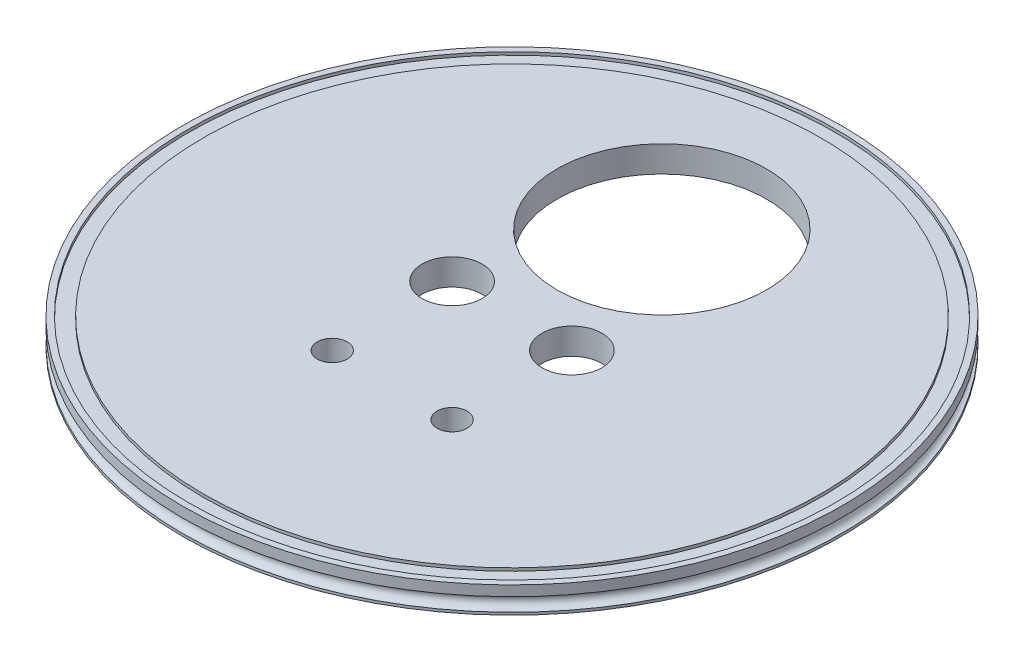
ISO-10303-21;
HEADER;
FILE_DESCRIPTION(('STEP AP214'),'2;1');
FILE_NAME('part.step','',(''),(''),'','','');
FILE_SCHEMA(('AUTOMOTIVE_DESIGN { 1 0 10303 214 1 1 1 1 }'));
ENDSEC;
DATA;
#1=APPLICATION_CONTEXT('core data for automotive mechanical design processes');
#2=APPLICATION_PROTOCOL_DEFINITION('international standard','automotive_design',2000,#1);
#3=PRODUCT_CONTEXT('',#1,'mechanical');
#4=PRODUCT('Part','Part','',(#3));
#5=PRODUCT_RELATED_PRODUCT_CATEGORY('part','',(#4));
#6=PRODUCT_DEFINITION_FORMATION('','',#4);
#7=PRODUCT_DEFINITION_CONTEXT('part definition',#1,'design');
#8=PRODUCT_DEFINITION('design','',#6,#7);
#9=PRODUCT_DEFINITION_SHAPE('','',#8);
#10=(LENGTH_UNIT() NAMED_UNIT(*) SI_UNIT(.MILLI.,.METRE.));
#11=(NAMED_UNIT(*) PLANE_ANGLE_UNIT() SI_UNIT($,.RADIAN.));
#12=(NAMED_UNIT(*) SI_UNIT($,.STERADIAN.) SOLID_ANGLE_UNIT());
#13=UNCERTAINTY_MEASURE_WITH_UNIT(LENGTH_MEASURE(1.E-05),#10,'distance_accuracy_value','');
#14=(GEOMETRIC_REPRESENTATION_CONTEXT(3) GLOBAL_UNCERTAINTY_ASSIGNED_CONTEXT((#13)) GLOBAL_UNIT_ASSIGNED_CONTEXT((#10,
#11,#12)) REPRESENTATION_CONTEXT('',''));
#15=CARTESIAN_POINT('',(0.,0.,0.));
#16=DIRECTION('',(0.,0.,1.));
#17=DIRECTION('',(1.,0.,0.));
#18=AXIS2_PLACEMENT_3D('',#15,#16,#17);
#19=CARTESIAN_POINT('',(130.81,1.36495717747621,0.));
#20=DIRECTION('',(0.,-1.,0.));
#21=DIRECTION('',(0.,0.,-1.));
#22=AXIS2_PLACEMENT_3D('',#19,#20,#21);
#23=PLANE('',#22);
#24=CARTESIAN_POINT('',(0.,1.36495717747621,-63.5));
#25=DIRECTION('',(0.,1.,0.));
#26=DIRECTION('',(0.,0.,1.));
#27=AXIS2_PLACEMENT_3D('',#24,#25,#26);
#28=CIRCLE('',#27,44.45);
#29=CARTESIAN_POINT('',(0.,1.36495717747621,-19.05));
#30=VERTEX_POINT('',#29);
#31=EDGE_CURVE('E101',#30,#30,#28,.T.);
#32=ORIENTED_EDGE('',*,*,#31,.F.);
#33=EDGE_LOOP('',(#32));
#34=FACE_BOUND('',#33,.T.);
#35=CARTESIAN_POINT('',(-25.4,1.36495717747621,0.));
#36=DIRECTION('',(0.,-1.,0.));
#37=DIRECTION('',(0.,0.,-1.));
#38=AXIS2_PLACEMENT_3D('',#35,#36,#37);
#39=CIRCLE('',#38,12.7);
#40=CARTESIAN_POINT('',(-25.4,1.36495717747621,-12.7));
#41=VERTEX_POINT('',#40);
#42=EDGE_CURVE('E92',#41,#41,#39,.T.);
#43=ORIENTED_EDGE('',*,*,#42,.T.);
#44=EDGE_LOOP('',(#43));
#45=FACE_BOUND('',#44,.T.);
#46=CARTESIAN_POINT('',(25.4,1.36495717747621,0.));
#47=DIRECTION('',(0.,-1.,0.));
#48=DIRECTION('',(0.,0.,-1.));
#49=AXIS2_PLACEMENT_3D('',#46,#47,#48);
#50=CIRCLE('',#49,12.7);
#51=CARTESIAN_POINT('',(25.4,1.36495717747621,-12.7));
#52=VERTEX_POINT('',#51);
#53=EDGE_CURVE('E86',#52,#52,#50,.T.);
#54=ORIENTED_EDGE('',*,*,#53,.T.);
#55=EDGE_LOOP('',(#54));
#56=FACE_BOUND('',#55,.T.);
#57=CARTESIAN_POINT('',(-25.4,1.36495717747621,50.8));
#58=DIRECTION('',(0.,1.,0.));
#59=DIRECTION('',(0.,0.,1.));
#60=AXIS2_PLACEMENT_3D('',#57,#58,#59);
#61=CIRCLE('',#60,6.35);
#62=CARTESIAN_POINT('',(-25.4,1.36495717747621,57.15));
#63=VERTEX_POINT('',#62);
#64=EDGE_CURVE('E83',#63,#63,#61,.T.);
#65=ORIENTED_EDGE('',*,*,#64,.F.);
#66=EDGE_LOOP('',(#65));
#67=FACE_BOUND('',#66,.T.);
#68=CARTESIAN_POINT('',(25.4,1.36495717747621,50.8));
#69=DIRECTION('',(0.,1.,0.));
#70=DIRECTION('',(0.,0.,1.));
#71=AXIS2_PLACEMENT_3D('',#68,#69,#70);
#72=CIRCLE('',#71,6.35);
#73=CARTESIAN_POINT('',(25.4,1.36495717747621,57.15));
#74=VERTEX_POINT('',#73);
#75=EDGE_CURVE('E77',#74,#74,#72,.T.);
#76=ORIENTED_EDGE('',*,*,#75,.F.);
#77=EDGE_LOOP('',(#76));
#78=FACE_BOUND('',#77,.T.);
#79=CARTESIAN_POINT('',(0.,1.3649571774762,0.));
#80=DIRECTION('',(0.,1.,0.));
#81=DIRECTION('',(0.,0.,1.));
#82=AXIS2_PLACEMENT_3D('',#79,#80,#81);
#83=CIRCLE('',#82,130.81);
#84=CARTESIAN_POINT('',(0.,1.3649571774762,130.81));
#85=VERTEX_POINT('',#84);
#86=EDGE_CURVE('E73',#85,#85,#83,.T.);
#87=ORIENTED_EDGE('',*,*,#86,.T.);
#88=EDGE_LOOP('',(#87));
#89=FACE_BOUND('',#88,.T.);
#90=ADVANCED_FACE('F33',(#34,#45,#56,#67,#78,#89),#23,.F.);
#91=CARTESIAN_POINT('',(0.,-9.74754282252377,0.));
#92=DIRECTION('',(0.,1.,0.));
#93=DIRECTION('',(0.,0.,1.));
#94=AXIS2_PLACEMENT_3D('',#91,#92,#93);
#95=PLANE('',#94);
#96=CARTESIAN_POINT('',(0.,-9.74754282252377,-63.5));
#97=DIRECTION('',(0.,1.,0.));
#98=DIRECTION('',(0.,0.,1.));
#99=AXIS2_PLACEMENT_3D('',#96,#97,#98);
#100=CIRCLE('',#99,44.45);
#101=CARTESIAN_POINT('',(0.,-9.74754282252377,-19.05));
#102=VERTEX_POINT('',#101);
#103=EDGE_CURVE('E98',#102,#102,#100,.T.);
#104=ORIENTED_EDGE('',*,*,#103,.T.);
#105=EDGE_LOOP('',(#104));
#106=FACE_BOUND('',#105,.T.);
#107=CARTESIAN_POINT('',(-25.4,-9.74754282252377,0.));
#108=DIRECTION('',(0.,-1.,0.));
#109=DIRECTION('',(0.,0.,-1.));
#110=AXIS2_PLACEMENT_3D('',#107,#108,#109);
#111=CIRCLE('',#110,12.7);
#112=CARTESIAN_POINT('',(-25.4,-9.74754282252377,-12.7));
#113=VERTEX_POINT('',#112);
#114=EDGE_CURVE('E95',#113,#113,#111,.T.);
#115=ORIENTED_EDGE('',*,*,#114,.F.);
#116=EDGE_LOOP('',(#115));
#117=FACE_BOUND('',#116,.T.);
#118=CARTESIAN_POINT('',(25.4,-9.74754282252377,0.));
#119=DIRECTION('',(0.,-1.,0.));
#120=DIRECTION('',(0.,0.,-1.));
#121=AXIS2_PLACEMENT_3D('',#118,#119,#120);
#122=CIRCLE('',#121,12.7);
#123=CARTESIAN_POINT('',(25.4,-9.74754282252377,-12.7));
#124=VERTEX_POINT('',#123);
#125=EDGE_CURVE('E89',#124,#124,#122,.T.);
#126=ORIENTED_EDGE('',*,*,#125,.F.);
#127=EDGE_LOOP('',(#126));
#128=FACE_BOUND('',#127,.T.);
#129=CARTESIAN_POINT('',(-25.4,-9.74754282252377,50.8));
#130=DIRECTION('',(0.,1.,0.));
#131=DIRECTION('',(0.,0.,1.));
#132=AXIS2_PLACEMENT_3D('',#129,#130,#131);
#133=CIRCLE('',#132,6.35);
#134=CARTESIAN_POINT('',(-25.4,-9.74754282252377,57.15));
#135=VERTEX_POINT('',#134);
#136=EDGE_CURVE('E80',#135,#135,#133,.T.);
#137=ORIENTED_EDGE('',*,*,#136,.T.);
#138=EDGE_LOOP('',(#137));
#139=FACE_BOUND('',#138,.T.);
#140=CARTESIAN_POINT('',(25.4,-9.74754282252377,50.8));
#141=DIRECTION('',(0.,1.,0.));
#142=DIRECTION('',(0.,0.,1.));
#143=AXIS2_PLACEMENT_3D('',#140,#141,#142);
#144=CIRCLE('',#143,6.35);
#145=CARTESIAN_POINT('',(25.4,-9.74754282252377,57.15));
#146=VERTEX_POINT('',#145);
#147=EDGE_CURVE('E76',#146,#146,#144,.T.);
#148=ORIENTED_EDGE('',*,*,#147,.T.);
#149=EDGE_LOOP('',(#148));
#150=FACE_BOUND('',#149,.T.);
#151=CARTESIAN_POINT('',(0.,-9.74754282252377,0.));
#152=DIRECTION('',(0.,1.,0.));
#153=DIRECTION('',(0.,0.,1.));
#154=AXIS2_PLACEMENT_3D('',#151,#152,#153);
#155=CIRCLE('',#154,120.65);
#156=CARTESIAN_POINT('',(0.,-9.74754282252377,120.65));
#157=VERTEX_POINT('',#156);
#158=EDGE_CURVE('E10',#157,#157,#155,.T.);
#159=ORIENTED_EDGE('',*,*,#158,.F.);
#160=EDGE_LOOP('',(#159));
#161=FACE_BOUND('',#160,.T.);
#162=ADVANCED_FACE('F107',(#106,#117,#128,#139,#150,#161),#95,.F.);
#163=CARTESIAN_POINT('',(0.,12.263795045045,0.));
#164=DIRECTION('',(0.,1.,0.));
#165=DIRECTION('',(0.,0.,1.));
#166=AXIS2_PLACEMENT_3D('',#163,#164,#165);
#167=CYLINDRICAL_SURFACE('',#166,120.65);
#168=CARTESIAN_POINT('',(0.,-7.20754282252377,0.));
#169=DIRECTION('',(0.,1.,0.));
#170=DIRECTION('',(0.,0.,1.));
#171=AXIS2_PLACEMENT_3D('',#168,#169,#170);
#172=CIRCLE('',#171,120.65);
#173=CARTESIAN_POINT('',(0.,-7.20754282252377,120.65));
#174=VERTEX_POINT('',#173);
#175=EDGE_CURVE('E39',#174,#174,#172,.T.);
#176=ORIENTED_EDGE('',*,*,#175,.F.);
#177=EDGE_LOOP('',(#176));
#178=FACE_BOUND('',#177,.T.);
#179=ORIENTED_EDGE('',*,*,#158,.T.);
#180=EDGE_LOOP('',(#179));
#181=FACE_BOUND('',#180,.T.);
#182=ADVANCED_FACE('F186',(#178,#181),#167,.T.);
#183=CARTESIAN_POINT('',(120.65,-7.20754282252377,0.));
#184=DIRECTION('',(0.,1.,0.));
#185=DIRECTION('',(0.,0.,1.));
#186=AXIS2_PLACEMENT_3D('',#183,#184,#185);
#187=PLANE('',#186);
#188=CARTESIAN_POINT('',(0.,-7.20754282252377,0.));
#189=DIRECTION('',(0.,1.,0.));
#190=DIRECTION('',(0.,0.,1.));
#191=AXIS2_PLACEMENT_3D('',#188,#189,#190);
#192=CIRCLE('',#191,127.);
#193=CARTESIAN_POINT('',(0.,-7.20754282252377,127.));
#194=VERTEX_POINT('',#193);
#195=EDGE_CURVE('E43',#194,#194,#192,.T.);
#196=ORIENTED_EDGE('',*,*,#195,.F.);
#197=EDGE_LOOP('',(#196));
#198=FACE_BOUND('',#197,.T.);
#199=ORIENTED_EDGE('',*,*,#175,.T.);
#200=EDGE_LOOP('',(#199));
#201=FACE_BOUND('',#200,.T.);
#202=ADVANCED_FACE('F181',(#198,#201),#187,.F.);
#203=CARTESIAN_POINT('',(0.,12.263795045045,0.));
#204=DIRECTION('',(0.,1.,0.));
#205=DIRECTION('',(0.,0.,1.));
#206=AXIS2_PLACEMENT_3D('',#203,#204,#205);
#207=CYLINDRICAL_SURFACE('',#206,127.);
#208=CARTESIAN_POINT('',(0.,-9.74754282252377,0.));
#209=DIRECTION('',(0.,1.,0.));
#210=DIRECTION('',(0.,0.,1.));
#211=AXIS2_PLACEMENT_3D('',#208,#209,#210);
#212=CIRCLE('',#211,127.);
#213=CARTESIAN_POINT('',(0.,-9.74754282252377,127.));
#214=VERTEX_POINT('',#213);
#215=EDGE_CURVE('E47',#214,#214,#212,.T.);
#216=ORIENTED_EDGE('',*,*,#215,.F.);
#217=EDGE_LOOP('',(#216));
#218=FACE_BOUND('',#217,.T.);
#219=ORIENTED_EDGE('',*,*,#195,.T.);
#220=EDGE_LOOP('',(#219));
#221=FACE_BOUND('',#220,.T.);
#222=ADVANCED_FACE('F175',(#218,#221),#207,.F.);
#223=CARTESIAN_POINT('',(127.,-9.74754282252377,0.));
#224=DIRECTION('',(0.,1.,0.));
#225=DIRECTION('',(0.,0.,1.));
#226=AXIS2_PLACEMENT_3D('',#223,#224,#225);
#227=PLANE('',#226);
#228=CARTESIAN_POINT('',(0.,-9.74754282252377,0.));
#229=DIRECTION('',(0.,1.,0.));
#230=DIRECTION('',(0.,0.,1.));
#231=AXIS2_PLACEMENT_3D('',#228,#229,#230);
#232=CIRCLE('',#231,139.7);
#233=CARTESIAN_POINT('',(0.,-9.74754282252377,139.7));
#234=VERTEX_POINT('',#233);
#235=EDGE_CURVE('E52',#234,#234,#232,.T.);
#236=ORIENTED_EDGE('',*,*,#235,.F.);
#237=EDGE_LOOP('',(#236));
#238=FACE_BOUND('',#237,.T.);
#239=ORIENTED_EDGE('',*,*,#215,.T.);
#240=EDGE_LOOP('',(#239));
#241=FACE_BOUND('',#240,.T.);
#242=ADVANCED_FACE('F169',(#238,#241),#227,.F.);
#243=CARTESIAN_POINT('',(0.,12.263795045045,0.));
#244=DIRECTION('',(0.,1.,0.));
#245=DIRECTION('',(0.,0.,1.));
#246=AXIS2_PLACEMENT_3D('',#243,#244,#245);
#247=CYLINDRICAL_SURFACE('',#246,139.7);
#248=CARTESIAN_POINT('',(0.,-8.66804282252376,0.));
#249=DIRECTION('',(0.,1.,0.));
#250=DIRECTION('',(0.,0.,1.));
#251=AXIS2_PLACEMENT_3D('',#248,#249,#250);
#252=CIRCLE('',#251,139.7);
#253=CARTESIAN_POINT('',(0.,-8.66804282252376,139.7));
#254=VERTEX_POINT('',#253);
#255=EDGE_CURVE('E55',#254,#254,#252,.T.);
#256=ORIENTED_EDGE('',*,*,#255,.F.);
#257=EDGE_LOOP('',(#256));
#258=FACE_BOUND('',#257,.T.);
#259=ORIENTED_EDGE('',*,*,#235,.T.);
#260=EDGE_LOOP('',(#259));
#261=FACE_BOUND('',#260,.T.);
#262=ADVANCED_FACE('F163',(#258,#261),#247,.T.);
#263=CARTESIAN_POINT('',(0.,-5.81054282252378,0.));
#264=DIRECTION('',(0.,1.,0.));
#265=DIRECTION('',(0.,0.,1.));
#266=AXIS2_PLACEMENT_3D('',#263,#264,#265);
#267=TOROIDAL_SURFACE('',#266,139.7,2.85749999999998);
#268=CARTESIAN_POINT('',(0.,-2.9530428225238,0.));
#269=DIRECTION('',(0.,1.,0.));
#270=DIRECTION('',(0.,0.,1.));
#271=AXIS2_PLACEMENT_3D('',#268,#269,#270);
#272=CIRCLE('',#271,139.7);
#273=CARTESIAN_POINT('',(0.,-2.9530428225238,139.7));
#274=VERTEX_POINT('',#273);
#275=EDGE_CURVE('E58',#274,#274,#272,.T.);
#276=ORIENTED_EDGE('',*,*,#275,.F.);
#277=EDGE_LOOP('',(#276));
#278=FACE_BOUND('',#277,.T.);
#279=ORIENTED_EDGE('',*,*,#255,.T.);
#280=EDGE_LOOP('',(#279));
#281=FACE_BOUND('',#280,.T.);
#282=ADVANCED_FACE('F157',(#278,#281),#267,.F.);
#283=CARTESIAN_POINT('',(0.,12.263795045045,0.));
#284=DIRECTION('',(0.,1.,0.));
#285=DIRECTION('',(0.,0.,1.));
#286=AXIS2_PLACEMENT_3D('',#283,#284,#285);
#287=CYLINDRICAL_SURFACE('',#286,139.7);
#288=CARTESIAN_POINT('',(0.,1.3649571774762,0.));
#289=DIRECTION('',(0.,1.,0.));
#290=DIRECTION('',(0.,0.,1.));
#291=AXIS2_PLACEMENT_3D('',#288,#289,#290);
#292=CIRCLE('',#291,139.7);
#293=CARTESIAN_POINT('',(0.,1.3649571774762,139.7));
#294=VERTEX_POINT('',#293);
#295=EDGE_CURVE('E61',#294,#294,#292,.T.);
#296=ORIENTED_EDGE('',*,*,#295,.F.);
#297=EDGE_LOOP('',(#296));
#298=FACE_BOUND('',#297,.T.);
#299=ORIENTED_EDGE('',*,*,#275,.T.);
#300=EDGE_LOOP('',(#299));
#301=FACE_BOUND('',#300,.T.);
#302=ADVANCED_FACE('F151',(#298,#301),#287,.T.);
#303=CARTESIAN_POINT('',(139.7,1.3649571774762,0.));
#304=DIRECTION('',(0.,-1.,0.));
#305=DIRECTION('',(0.,0.,-1.));
#306=AXIS2_PLACEMENT_3D('',#303,#304,#305);
#307=PLANE('',#306);
#308=CARTESIAN_POINT('',(0.,1.3649571774762,0.));
#309=DIRECTION('',(0.,1.,0.));
#310=DIRECTION('',(0.,0.,1.));
#311=AXIS2_PLACEMENT_3D('',#308,#309,#310);
#312=CIRCLE('',#311,137.16);
#313=CARTESIAN_POINT('',(0.,1.3649571774762,137.16));
#314=VERTEX_POINT('',#313);
#315=EDGE_CURVE('E64',#314,#314,#312,.T.);
#316=ORIENTED_EDGE('',*,*,#315,.F.);
#317=EDGE_LOOP('',(#316));
#318=FACE_BOUND('',#317,.T.);
#319=ORIENTED_EDGE('',*,*,#295,.T.);
#320=EDGE_LOOP('',(#319));
#321=FACE_BOUND('',#320,.T.);
#322=ADVANCED_FACE('F145',(#318,#321),#307,.F.);
#323=CARTESIAN_POINT('',(0.,12.263795045045,0.));
#324=DIRECTION('',(0.,1.,0.));
#325=DIRECTION('',(0.,0.,1.));
#326=AXIS2_PLACEMENT_3D('',#323,#324,#325);
#327=CYLINDRICAL_SURFACE('',#326,137.16);
#328=CARTESIAN_POINT('',(0.,0.094957177476233,0.));
#329=DIRECTION('',(0.,1.,0.));
#330=DIRECTION('',(0.,0.,1.));
#331=AXIS2_PLACEMENT_3D('',#328,#329,#330);
#332=CIRCLE('',#331,137.16);
#333=CARTESIAN_POINT('',(0.,0.094957177476233,137.16));
#334=VERTEX_POINT('',#333);
#335=EDGE_CURVE('E67',#334,#334,#332,.T.);
#336=ORIENTED_EDGE('',*,*,#335,.F.);
#337=EDGE_LOOP('',(#336));
#338=FACE_BOUND('',#337,.T.);
#339=ORIENTED_EDGE('',*,*,#315,.T.);
#340=EDGE_LOOP('',(#339));
#341=FACE_BOUND('',#340,.T.);
#342=ADVANCED_FACE('F139',(#338,#341),#327,.F.);
#343=CARTESIAN_POINT('',(130.81,0.0949571774762326,0.));
#344=DIRECTION('',(0.,-1.,0.));
#345=DIRECTION('',(0.,0.,-1.));
#346=AXIS2_PLACEMENT_3D('',#343,#344,#345);
#347=PLANE('',#346);
#348=CARTESIAN_POINT('',(0.,0.094957177476233,0.));
#349=DIRECTION('',(0.,1.,0.));
#350=DIRECTION('',(0.,0.,1.));
#351=AXIS2_PLACEMENT_3D('',#348,#349,#350);
#352=CIRCLE('',#351,130.81);
#353=CARTESIAN_POINT('',(0.,0.094957177476233,130.81));
#354=VERTEX_POINT('',#353);
#355=EDGE_CURVE('E70',#354,#354,#352,.T.);
#356=ORIENTED_EDGE('',*,*,#355,.F.);
#357=EDGE_LOOP('',(#356));
#358=FACE_BOUND('',#357,.T.);
#359=ORIENTED_EDGE('',*,*,#335,.T.);
#360=EDGE_LOOP('',(#359));
#361=FACE_BOUND('',#360,.T.);
#362=ADVANCED_FACE('F133',(#358,#361),#347,.F.);
#363=CARTESIAN_POINT('',(0.,12.263795045045,0.));
#364=DIRECTION('',(0.,1.,0.));
#365=DIRECTION('',(0.,0.,1.));
#366=AXIS2_PLACEMENT_3D('',#363,#364,#365);
#367=CYLINDRICAL_SURFACE('',#366,130.81);
#368=ORIENTED_EDGE('',*,*,#86,.F.);
#369=EDGE_LOOP('',(#368));
#370=FACE_BOUND('',#369,.T.);
#371=ORIENTED_EDGE('',*,*,#355,.T.);
#372=EDGE_LOOP('',(#371));
#373=FACE_BOUND('',#372,.T.);
#374=ADVANCED_FACE('F129',(#370,#373),#367,.T.);
#375=CARTESIAN_POINT('',(25.4,-9.74754282252377,50.8));
#376=DIRECTION('',(0.,1.,0.));
#377=DIRECTION('',(0.,0.,1.));
#378=AXIS2_PLACEMENT_3D('',#375,#376,#377);
#379=CYLINDRICAL_SURFACE('',#378,6.35);
#380=ORIENTED_EDGE('',*,*,#147,.F.);
#381=EDGE_LOOP('',(#380));
#382=FACE_BOUND('',#381,.T.);
#383=ORIENTED_EDGE('',*,*,#75,.T.);
#384=EDGE_LOOP('',(#383));
#385=FACE_BOUND('',#384,.T.);
#386=ADVANCED_FACE('F132',(#382,#385),#379,.F.);
#387=CARTESIAN_POINT('',(-25.4,-9.74754282252377,50.8));
#388=DIRECTION('',(0.,1.,0.));
#389=DIRECTION('',(0.,0.,1.));
#390=AXIS2_PLACEMENT_3D('',#387,#388,#389);
#391=CYLINDRICAL_SURFACE('',#390,6.35);
#392=ORIENTED_EDGE('',*,*,#136,.F.);
#393=EDGE_LOOP('',(#392));
#394=FACE_BOUND('',#393,.T.);
#395=ORIENTED_EDGE('',*,*,#64,.T.);
#396=EDGE_LOOP('',(#395));
#397=FACE_BOUND('',#396,.T.);
#398=ADVANCED_FACE('F270',(#394,#397),#391,.F.);
#399=CARTESIAN_POINT('',(25.4,1.36495717747621,0.));
#400=DIRECTION('',(0.,-1.,0.));
#401=DIRECTION('',(0.,0.,-1.));
#402=AXIS2_PLACEMENT_3D('',#399,#400,#401);
#403=CYLINDRICAL_SURFACE('',#402,12.7);
#404=ORIENTED_EDGE('',*,*,#53,.F.);
#405=EDGE_LOOP('',(#404));
#406=FACE_BOUND('',#405,.T.);
#407=ORIENTED_EDGE('',*,*,#125,.T.);
#408=EDGE_LOOP('',(#407));
#409=FACE_BOUND('',#408,.T.);
#410=ADVANCED_FACE('F280',(#406,#409),#403,.F.);
#411=CARTESIAN_POINT('',(-25.4,1.36495717747621,0.));
#412=DIRECTION('',(0.,-1.,0.));
#413=DIRECTION('',(0.,0.,-1.));
#414=AXIS2_PLACEMENT_3D('',#411,#412,#413);
#415=CYLINDRICAL_SURFACE('',#414,12.7);
#416=ORIENTED_EDGE('',*,*,#42,.F.);
#417=EDGE_LOOP('',(#416));
#418=FACE_BOUND('',#417,.T.);
#419=ORIENTED_EDGE('',*,*,#114,.T.);
#420=EDGE_LOOP('',(#419));
#421=FACE_BOUND('',#420,.T.);
#422=ADVANCED_FACE('F113',(#418,#421),#415,.F.);
#423=CARTESIAN_POINT('',(0.,-9.74754282252377,-63.5));
#424=DIRECTION('',(0.,1.,0.));
#425=DIRECTION('',(0.,0.,1.));
#426=AXIS2_PLACEMENT_3D('',#423,#424,#425);
#427=CYLINDRICAL_SURFACE('',#426,44.45);
#428=ORIENTED_EDGE('',*,*,#103,.F.);
#429=EDGE_LOOP('',(#428));
#430=FACE_BOUND('',#429,.T.);
#431=ORIENTED_EDGE('',*,*,#31,.T.);
#432=EDGE_LOOP('',(#431));
#433=FACE_BOUND('',#432,.T.);
#434=ADVANCED_FACE('F110',(#430,#433),#427,.F.);
#435=CLOSED_SHELL('',(#90,#162,#182,#202,#222,#242,#262,#282,#302,#322,#342,#362,#374,#386,#398,
#410,#422,#434));
#436=MANIFOLD_SOLID_BREP('B2',#435);
#437=ADVANCED_BREP_SHAPE_REPRESENTATION('',(#18,#436),#14);
#438=SHAPE_DEFINITION_REPRESENTATION(#9,#437);
ENDSEC;
END-ISO-10303-21;
